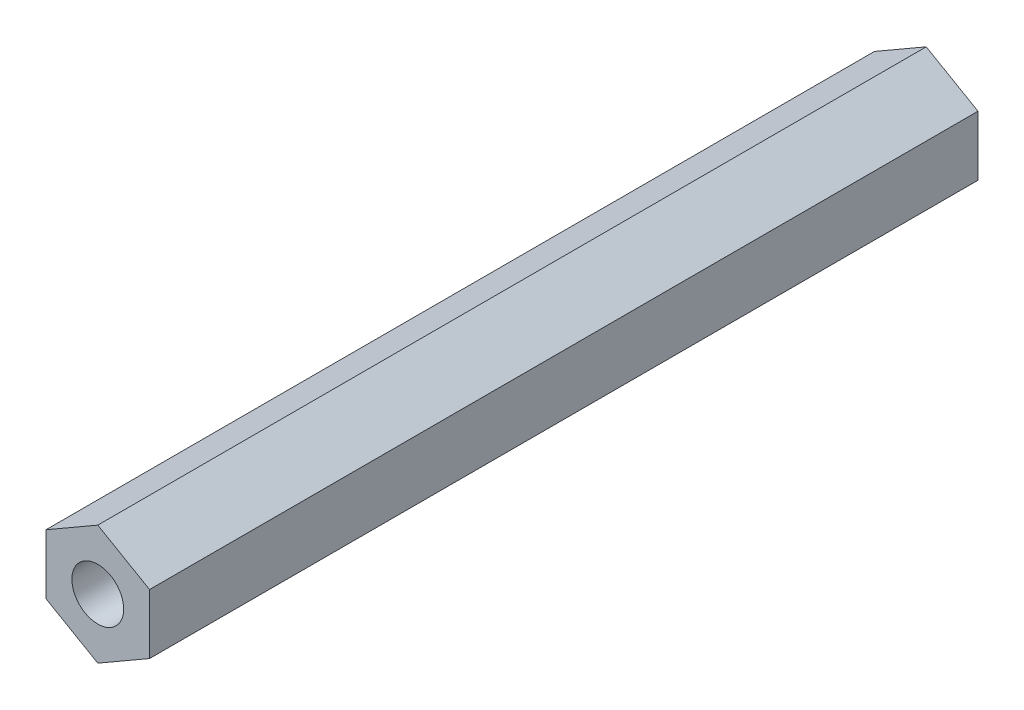
ISO-10303-21;
HEADER;
FILE_DESCRIPTION(('STEP AP214'),'2;1');
FILE_NAME('part.step','',(''),(''),'','','');
FILE_SCHEMA(('AUTOMOTIVE_DESIGN { 1 0 10303 214 1 1 1 1 }'));
ENDSEC;
DATA;
#1=APPLICATION_CONTEXT('core data for automotive mechanical design processes');
#2=APPLICATION_PROTOCOL_DEFINITION('international standard','automotive_design',2000,#1);
#3=PRODUCT_CONTEXT('',#1,'mechanical');
#4=PRODUCT('Part','Part','',(#3));
#5=PRODUCT_RELATED_PRODUCT_CATEGORY('part','',(#4));
#6=PRODUCT_DEFINITION_FORMATION('','',#4);
#7=PRODUCT_DEFINITION_CONTEXT('part definition',#1,'design');
#8=PRODUCT_DEFINITION('design','',#6,#7);
#9=PRODUCT_DEFINITION_SHAPE('','',#8);
#10=(LENGTH_UNIT() NAMED_UNIT(*) SI_UNIT(.MILLI.,.METRE.));
#11=(NAMED_UNIT(*) PLANE_ANGLE_UNIT() SI_UNIT($,.RADIAN.));
#12=(NAMED_UNIT(*) SI_UNIT($,.STERADIAN.) SOLID_ANGLE_UNIT());
#13=UNCERTAINTY_MEASURE_WITH_UNIT(LENGTH_MEASURE(1.E-05),#10,'distance_accuracy_value','');
#14=(GEOMETRIC_REPRESENTATION_CONTEXT(3) GLOBAL_UNCERTAINTY_ASSIGNED_CONTEXT((#13)) GLOBAL_UNIT_ASSIGNED_CONTEXT((#10,
#11,#12)) REPRESENTATION_CONTEXT('',''));
#15=CARTESIAN_POINT('',(0.,0.,0.));
#16=DIRECTION('',(0.,0.,1.));
#17=DIRECTION('',(1.,0.,0.));
#18=AXIS2_PLACEMENT_3D('',#15,#16,#17);
#19=CARTESIAN_POINT('',(0.,0.,8.49999999991269));
#20=DIRECTION('',(0.,0.,1.));
#21=DIRECTION('',(1.,0.,0.));
#22=AXIS2_PLACEMENT_3D('',#19,#20,#21);
#23=CONICAL_SURFACE('',#22,1.24999999985675,1.02974425848792);
#24=CARTESIAN_POINT('',(-1.70530256582424E-10,0.,7.74892422614926));
#25=VERTEX_POINT('',#24);
#26=VERTEX_LOOP('',#25);
#27=FACE_BOUND('',#26,.T.);
#28=CARTESIAN_POINT('',(0.,0.,8.5));
#29=DIRECTION('',(0.,0.,1.));
#30=DIRECTION('',(1.,0.,0.));
#31=AXIS2_PLACEMENT_3D('',#28,#29,#30);
#32=CIRCLE('',#31,1.25);
#33=CARTESIAN_POINT('',(1.25,0.,8.5));
#34=VERTEX_POINT('',#33);
#35=EDGE_CURVE('E77',#34,#34,#32,.T.);
#36=ORIENTED_EDGE('',*,*,#35,.T.);
#37=EDGE_LOOP('',(#36));
#38=FACE_BOUND('',#37,.T.);
#39=ADVANCED_FACE('F16',(#27,#38),#23,.F.);
#40=CARTESIAN_POINT('',(0.,0.,-8.50000000002638));
#41=DIRECTION('',(0.,0.,-1.));
#42=DIRECTION('',(-1.,0.,0.));
#43=AXIS2_PLACEMENT_3D('',#40,#41,#42);
#44=CONICAL_SURFACE('',#43,1.25000000002728,1.02974425868194);
#45=CARTESIAN_POINT('',(0.,0.,-7.74892422623452));
#46=VERTEX_POINT('',#45);
#47=VERTEX_LOOP('',#46);
#48=FACE_BOUND('',#47,.T.);
#49=CARTESIAN_POINT('',(0.,0.,-8.5));
#50=DIRECTION('',(0.,0.,-1.));
#51=DIRECTION('',(-1.,0.,0.));
#52=AXIS2_PLACEMENT_3D('',#49,#50,#51);
#53=CIRCLE('',#52,1.24999999999999);
#54=CARTESIAN_POINT('',(-1.24999999999999,0.,-8.5));
#55=VERTEX_POINT('',#54);
#56=EDGE_CURVE('E79',#55,#55,#53,.T.);
#57=ORIENTED_EDGE('',*,*,#56,.T.);
#58=EDGE_LOOP('',(#57));
#59=FACE_BOUND('',#58,.T.);
#60=ADVANCED_FACE('F74',(#48,#59),#44,.F.);
#61=CARTESIAN_POINT('',(0.,0.,20.));
#62=DIRECTION('',(0.,0.,1.));
#63=DIRECTION('',(1.,0.,0.));
#64=AXIS2_PLACEMENT_3D('',#61,#62,#63);
#65=CYLINDRICAL_SURFACE('',#64,1.25);
#66=CARTESIAN_POINT('',(0.,0.,20.));
#67=DIRECTION('',(0.,0.,1.));
#68=DIRECTION('',(1.,0.,0.));
#69=AXIS2_PLACEMENT_3D('',#66,#67,#68);
#70=CIRCLE('',#69,1.25);
#71=CARTESIAN_POINT('',(1.25,0.,20.));
#72=VERTEX_POINT('',#71);
#73=EDGE_CURVE('E19',#72,#72,#70,.F.);
#74=ORIENTED_EDGE('',*,*,#73,.F.);
#75=EDGE_LOOP('',(#74));
#76=FACE_BOUND('',#75,.T.);
#77=ORIENTED_EDGE('',*,*,#35,.F.);
#78=EDGE_LOOP('',(#77));
#79=FACE_BOUND('',#78,.T.);
#80=ADVANCED_FACE('F233',(#76,#79),#65,.F.);
#81=CARTESIAN_POINT('',(0.,0.,-20.));
#82=DIRECTION('',(0.,0.,-1.));
#83=DIRECTION('',(-1.,0.,0.));
#84=AXIS2_PLACEMENT_3D('',#81,#82,#83);
#85=CYLINDRICAL_SURFACE('',#84,1.24999999999999);
#86=ORIENTED_EDGE('',*,*,#56,.F.);
#87=EDGE_LOOP('',(#86));
#88=FACE_BOUND('',#87,.T.);
#89=CARTESIAN_POINT('',(0.,0.,-20.));
#90=DIRECTION('',(0.,0.,-1.));
#91=DIRECTION('',(-1.,0.,0.));
#92=AXIS2_PLACEMENT_3D('',#89,#90,#91);
#93=CIRCLE('',#92,1.24999999999999);
#94=CARTESIAN_POINT('',(-1.24999999999999,0.,-20.));
#95=VERTEX_POINT('',#94);
#96=EDGE_CURVE('E85',#95,#95,#93,.T.);
#97=ORIENTED_EDGE('',*,*,#96,.T.);
#98=EDGE_LOOP('',(#97));
#99=FACE_BOUND('',#98,.T.);
#100=ADVANCED_FACE('F224',(#88,#99),#85,.F.);
#101=CARTESIAN_POINT('',(-2.5,1.44337567297406,20.));
#102=DIRECTION('',(1.,0.,0.));
#103=DIRECTION('',(0.,0.,-1.));
#104=AXIS2_PLACEMENT_3D('',#101,#102,#103);
#105=PLANE('',#104);
#106=DIRECTION('',(0.,0.,1.));
#107=VECTOR('',#106,1.);
#108=CARTESIAN_POINT('',(-2.5,-1.44337567297407,20.));
#109=LINE('',#108,#107);
#110=CARTESIAN_POINT('',(-2.5,-1.44337567297407,-20.));
#111=VERTEX_POINT('',#110);
#112=CARTESIAN_POINT('',(-2.5,-1.44337567297407,20.));
#113=VERTEX_POINT('',#112);
#114=EDGE_CURVE('E82',#111,#113,#109,.T.);
#115=ORIENTED_EDGE('',*,*,#114,.T.);
#116=DIRECTION('',(0.,1.,0.));
#117=VECTOR('',#116,1.);
#118=CARTESIAN_POINT('',(-2.5,2.88675134594813,20.));
#119=LINE('',#118,#117);
#120=CARTESIAN_POINT('',(-2.5,1.44337567297406,20.));
#121=VERTEX_POINT('',#120);
#122=EDGE_CURVE('E107',#121,#113,#119,.F.);
#123=ORIENTED_EDGE('',*,*,#122,.F.);
#124=DIRECTION('',(0.,0.,1.));
#125=VECTOR('',#124,1.);
#126=CARTESIAN_POINT('',(-2.5,1.44337567297406,20.));
#127=LINE('',#126,#125);
#128=CARTESIAN_POINT('',(-2.5,1.44337567297406,-20.));
#129=VERTEX_POINT('',#128);
#130=EDGE_CURVE('E87',#121,#129,#127,.F.);
#131=ORIENTED_EDGE('',*,*,#130,.T.);
#132=DIRECTION('',(0.,1.,0.));
#133=VECTOR('',#132,1.);
#134=CARTESIAN_POINT('',(-2.5,2.88675134594813,-20.));
#135=LINE('',#134,#133);
#136=EDGE_CURVE('E90',#129,#111,#135,.F.);
#137=ORIENTED_EDGE('',*,*,#136,.T.);
#138=EDGE_LOOP('',(#115,#123,#131,#137));
#139=FACE_BOUND('',#138,.T.);
#140=ADVANCED_FACE('F116',(#139),#105,.F.);
#141=CARTESIAN_POINT('',(-2.5,-1.44337567297407,20.));
#142=DIRECTION('',(0.5,0.866025403784439,0.));
#143=DIRECTION('',(-0.866025403784439,0.5,0.));
#144=AXIS2_PLACEMENT_3D('',#141,#142,#143);
#145=PLANE('',#144);
#146=DIRECTION('',(0.,0.,1.));
#147=VECTOR('',#146,1.);
#148=CARTESIAN_POINT('',(0.,-2.88675134594813,20.));
#149=LINE('',#148,#147);
#150=CARTESIAN_POINT('',(0.,-2.88675134594813,-20.));
#151=VERTEX_POINT('',#150);
#152=CARTESIAN_POINT('',(0.,-2.88675134594813,20.));
#153=VERTEX_POINT('',#152);
#154=EDGE_CURVE('E112',#151,#153,#149,.T.);
#155=ORIENTED_EDGE('',*,*,#154,.T.);
#156=DIRECTION('',(0.866025403784439,-0.5,0.));
#157=VECTOR('',#156,1.);
#158=CARTESIAN_POINT('',(-2.5,-1.44337567297407,20.));
#159=LINE('',#158,#157);
#160=EDGE_CURVE('E105',#113,#153,#159,.T.);
#161=ORIENTED_EDGE('',*,*,#160,.F.);
#162=ORIENTED_EDGE('',*,*,#114,.F.);
#163=DIRECTION('',(0.866025403784439,-0.5,0.));
#164=VECTOR('',#163,1.);
#165=CARTESIAN_POINT('',(-2.5,-1.44337567297407,-20.));
#166=LINE('',#165,#164);
#167=EDGE_CURVE('E146',#111,#151,#166,.T.);
#168=ORIENTED_EDGE('',*,*,#167,.T.);
#169=EDGE_LOOP('',(#155,#161,#162,#168));
#170=FACE_BOUND('',#169,.T.);
#171=ADVANCED_FACE('F120',(#170),#145,.F.);
#172=CARTESIAN_POINT('',(0.,-2.88675134594813,20.));
#173=DIRECTION('',(-0.5,0.866025403784439,0.));
#174=DIRECTION('',(-0.866025403784439,-0.5,0.));
#175=AXIS2_PLACEMENT_3D('',#172,#173,#174);
#176=PLANE('',#175);
#177=DIRECTION('',(0.,0.,1.));
#178=VECTOR('',#177,1.);
#179=CARTESIAN_POINT('',(2.5,-1.44337567297406,20.));
#180=LINE('',#179,#178);
#181=CARTESIAN_POINT('',(2.5,-1.44337567297406,-20.));
#182=VERTEX_POINT('',#181);
#183=CARTESIAN_POINT('',(2.5,-1.44337567297406,20.));
#184=VERTEX_POINT('',#183);
#185=EDGE_CURVE('E109',#182,#184,#180,.T.);
#186=ORIENTED_EDGE('',*,*,#185,.T.);
#187=DIRECTION('',(0.866025403784439,0.5,0.));
#188=VECTOR('',#187,1.);
#189=CARTESIAN_POINT('',(0.,-2.88675134594813,20.));
#190=LINE('',#189,#188);
#191=EDGE_CURVE('E103',#153,#184,#190,.T.);
#192=ORIENTED_EDGE('',*,*,#191,.F.);
#193=ORIENTED_EDGE('',*,*,#154,.F.);
#194=DIRECTION('',(0.866025403784439,0.5,0.));
#195=VECTOR('',#194,1.);
#196=CARTESIAN_POINT('',(0.,-2.88675134594813,-20.));
#197=LINE('',#196,#195);
#198=EDGE_CURVE('E143',#151,#182,#197,.T.);
#199=ORIENTED_EDGE('',*,*,#198,.T.);
#200=EDGE_LOOP('',(#186,#192,#193,#199));
#201=FACE_BOUND('',#200,.T.);
#202=ADVANCED_FACE('F152',(#201),#176,.F.);
#203=CARTESIAN_POINT('',(2.5,-1.44337567297406,20.));
#204=DIRECTION('',(-1.,0.,0.));
#205=DIRECTION('',(0.,0.,1.));
#206=AXIS2_PLACEMENT_3D('',#203,#204,#205);
#207=PLANE('',#206);
#208=DIRECTION('',(0.,0.,1.));
#209=VECTOR('',#208,1.);
#210=CARTESIAN_POINT('',(2.5,1.44337567297406,20.));
#211=LINE('',#210,#209);
#212=CARTESIAN_POINT('',(2.5,1.44337567297406,-20.));
#213=VERTEX_POINT('',#212);
#214=CARTESIAN_POINT('',(2.5,1.44337567297406,20.));
#215=VERTEX_POINT('',#214);
#216=EDGE_CURVE('E136',#213,#215,#211,.T.);
#217=ORIENTED_EDGE('',*,*,#216,.T.);
#218=DIRECTION('',(0.,1.,0.));
#219=VECTOR('',#218,1.);
#220=CARTESIAN_POINT('',(2.5,2.88675134594813,20.));
#221=LINE('',#220,#219);
#222=EDGE_CURVE('E98',#184,#215,#221,.T.);
#223=ORIENTED_EDGE('',*,*,#222,.F.);
#224=ORIENTED_EDGE('',*,*,#185,.F.);
#225=DIRECTION('',(0.,1.,0.));
#226=VECTOR('',#225,1.);
#227=CARTESIAN_POINT('',(2.5,2.88675134594813,-20.));
#228=LINE('',#227,#226);
#229=EDGE_CURVE('E140',#182,#213,#228,.T.);
#230=ORIENTED_EDGE('',*,*,#229,.T.);
#231=EDGE_LOOP('',(#217,#223,#224,#230));
#232=FACE_BOUND('',#231,.T.);
#233=ADVANCED_FACE('F155',(#232),#207,.F.);
#234=CARTESIAN_POINT('',(0.,2.88675134594813,20.));
#235=DIRECTION('',(0.,0.,1.));
#236=DIRECTION('',(1.,0.,0.));
#237=AXIS2_PLACEMENT_3D('',#234,#235,#236);
#238=PLANE('',#237);
#239=ORIENTED_EDGE('',*,*,#191,.T.);
#240=ORIENTED_EDGE('',*,*,#222,.T.);
#241=DIRECTION('',(0.866025403784439,-0.5,0.));
#242=VECTOR('',#241,1.);
#243=CARTESIAN_POINT('',(2.5,1.44337567297406,20.));
#244=LINE('',#243,#242);
#245=CARTESIAN_POINT('',(0.,2.88675134594813,20.));
#246=VERTEX_POINT('',#245);
#247=EDGE_CURVE('E127',#215,#246,#244,.F.);
#248=ORIENTED_EDGE('',*,*,#247,.T.);
#249=DIRECTION('',(0.866025403784439,0.5,0.));
#250=VECTOR('',#249,1.);
#251=CARTESIAN_POINT('',(0.,2.88675134594813,20.));
#252=LINE('',#251,#250);
#253=EDGE_CURVE('E92',#246,#121,#252,.F.);
#254=ORIENTED_EDGE('',*,*,#253,.T.);
#255=ORIENTED_EDGE('',*,*,#122,.T.);
#256=ORIENTED_EDGE('',*,*,#160,.T.);
#257=EDGE_LOOP('',(#239,#240,#248,#254,#255,#256));
#258=FACE_BOUND('',#257,.T.);
#259=ORIENTED_EDGE('',*,*,#73,.T.);
#260=EDGE_LOOP('',(#259));
#261=FACE_BOUND('',#260,.T.);
#262=ADVANCED_FACE('F123',(#258,#261),#238,.T.);
#263=CARTESIAN_POINT('',(0.,2.88675134594813,20.));
#264=DIRECTION('',(0.5,-0.866025403784439,0.));
#265=DIRECTION('',(0.866025403784439,0.5,0.));
#266=AXIS2_PLACEMENT_3D('',#263,#264,#265);
#267=PLANE('',#266);
#268=ORIENTED_EDGE('',*,*,#130,.F.);
#269=ORIENTED_EDGE('',*,*,#253,.F.);
#270=DIRECTION('',(0.,0.,1.));
#271=VECTOR('',#270,1.);
#272=CARTESIAN_POINT('',(0.,2.88675134594813,20.));
#273=LINE('',#272,#271);
#274=CARTESIAN_POINT('',(0.,2.88675134594813,-20.));
#275=VERTEX_POINT('',#274);
#276=EDGE_CURVE('E25',#246,#275,#273,.F.);
#277=ORIENTED_EDGE('',*,*,#276,.T.);
#278=DIRECTION('',(-0.866025403784438,-0.5,0.));
#279=VECTOR('',#278,1.);
#280=CARTESIAN_POINT('',(0.,2.88675134594813,-20.));
#281=LINE('',#280,#279);
#282=EDGE_CURVE('E33',#275,#129,#281,.T.);
#283=ORIENTED_EDGE('',*,*,#282,.T.);
#284=EDGE_LOOP('',(#268,#269,#277,#283));
#285=FACE_BOUND('',#284,.T.);
#286=ADVANCED_FACE('F131',(#285),#267,.F.);
#287=CARTESIAN_POINT('',(0.,2.88675134594813,-20.));
#288=DIRECTION('',(0.,0.,1.));
#289=DIRECTION('',(1.,0.,0.));
#290=AXIS2_PLACEMENT_3D('',#287,#288,#289);
#291=PLANE('',#290);
#292=ORIENTED_EDGE('',*,*,#229,.F.);
#293=ORIENTED_EDGE('',*,*,#198,.F.);
#294=ORIENTED_EDGE('',*,*,#167,.F.);
#295=ORIENTED_EDGE('',*,*,#136,.F.);
#296=ORIENTED_EDGE('',*,*,#282,.F.);
#297=DIRECTION('',(0.866025403784439,-0.5,0.));
#298=VECTOR('',#297,1.);
#299=CARTESIAN_POINT('',(2.5,1.44337567297406,-20.));
#300=LINE('',#299,#298);
#301=EDGE_CURVE('E11',#275,#213,#300,.T.);
#302=ORIENTED_EDGE('',*,*,#301,.T.);
#303=EDGE_LOOP('',(#292,#293,#294,#295,#296,#302));
#304=FACE_BOUND('',#303,.T.);
#305=ORIENTED_EDGE('',*,*,#96,.F.);
#306=EDGE_LOOP('',(#305));
#307=FACE_BOUND('',#306,.T.);
#308=ADVANCED_FACE('F149',(#304,#307),#291,.F.);
#309=CARTESIAN_POINT('',(2.5,1.44337567297406,20.));
#310=DIRECTION('',(-0.5,-0.866025403784439,0.));
#311=DIRECTION('',(0.866025403784439,-0.5,0.));
#312=AXIS2_PLACEMENT_3D('',#309,#310,#311);
#313=PLANE('',#312);
#314=ORIENTED_EDGE('',*,*,#276,.F.);
#315=ORIENTED_EDGE('',*,*,#247,.F.);
#316=ORIENTED_EDGE('',*,*,#216,.F.);
#317=ORIENTED_EDGE('',*,*,#301,.F.);
#318=EDGE_LOOP('',(#314,#315,#316,#317));
#319=FACE_BOUND('',#318,.T.);
#320=ADVANCED_FACE('F133',(#319),#313,.F.);
#321=CLOSED_SHELL('',(#39,#60,#80,#100,#140,#171,#202,#233,#262,#286,#308,#320));
#322=MANIFOLD_SOLID_BREP('B1',#321);
#323=ADVANCED_BREP_SHAPE_REPRESENTATION('',(#18,#322),#14);
#324=SHAPE_DEFINITION_REPRESENTATION(#9,#323);
ENDSEC;
END-ISO-10303-21;
